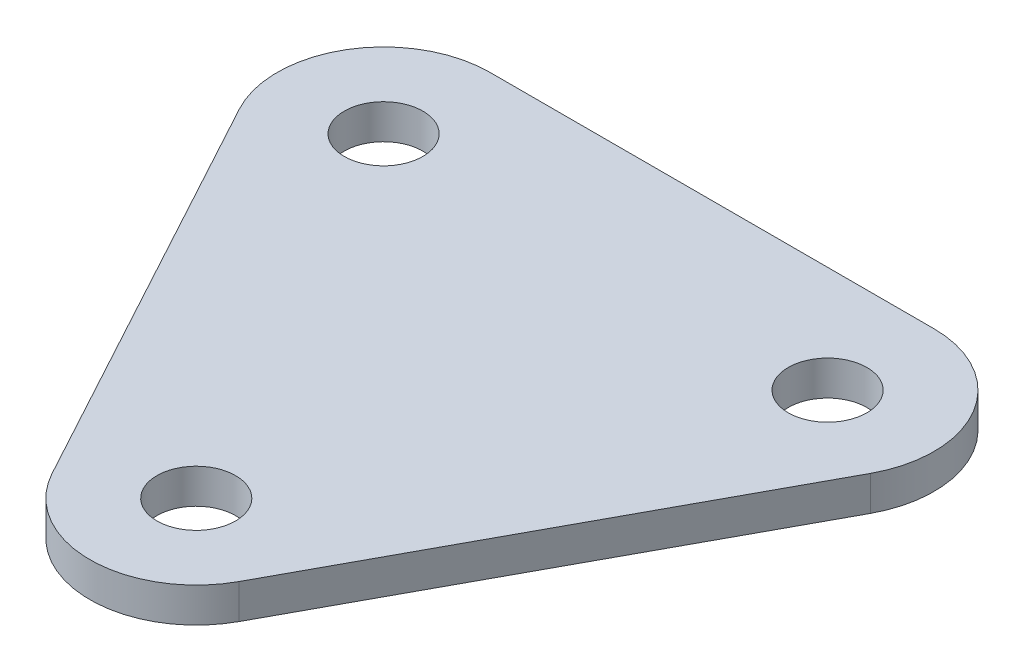
ISO-10303-21;
HEADER;
FILE_DESCRIPTION(('STEP AP214'),'2;1');
FILE_NAME('part.step','',(''),(''),'','','');
FILE_SCHEMA(('AUTOMOTIVE_DESIGN { 1 0 10303 214 1 1 1 1 }'));
ENDSEC;
DATA;
#1=APPLICATION_CONTEXT('core data for automotive mechanical design processes');
#2=APPLICATION_PROTOCOL_DEFINITION('international standard','automotive_design',2000,#1);
#3=PRODUCT_CONTEXT('',#1,'mechanical');
#4=PRODUCT('Part','Part','',(#3));
#5=PRODUCT_RELATED_PRODUCT_CATEGORY('part','',(#4));
#6=PRODUCT_DEFINITION_FORMATION('','',#4);
#7=PRODUCT_DEFINITION_CONTEXT('part definition',#1,'design');
#8=PRODUCT_DEFINITION('design','',#6,#7);
#9=PRODUCT_DEFINITION_SHAPE('','',#8);
#10=(LENGTH_UNIT() NAMED_UNIT(*) SI_UNIT(.MILLI.,.METRE.));
#11=(NAMED_UNIT(*) PLANE_ANGLE_UNIT() SI_UNIT($,.RADIAN.));
#12=(NAMED_UNIT(*) SI_UNIT($,.STERADIAN.) SOLID_ANGLE_UNIT());
#13=UNCERTAINTY_MEASURE_WITH_UNIT(LENGTH_MEASURE(1.E-05),#10,'distance_accuracy_value','');
#14=(GEOMETRIC_REPRESENTATION_CONTEXT(3) GLOBAL_UNCERTAINTY_ASSIGNED_CONTEXT((#13)) GLOBAL_UNIT_ASSIGNED_CONTEXT((#10,
#11,#12)) REPRESENTATION_CONTEXT('',''));
#15=CARTESIAN_POINT('',(0.,0.,0.));
#16=DIRECTION('',(0.,0.,1.));
#17=DIRECTION('',(1.,0.,0.));
#18=AXIS2_PLACEMENT_3D('',#15,#16,#17);
#19=CARTESIAN_POINT('',(48.,7.5,-38.059418617636));
#20=DIRECTION('',(0.,-1.,0.));
#21=DIRECTION('',(0.,0.,-1.));
#22=AXIS2_PLACEMENT_3D('',#19,#20,#21);
#23=CYLINDRICAL_SURFACE('',#22,23.);
#24=CARTESIAN_POINT('',(48.,0.,-38.059418617636));
#25=DIRECTION('',(0.,1.,0.));
#26=DIRECTION('',(0.,0.,1.));
#27=AXIS2_PLACEMENT_3D('',#24,#25,#26);
#28=CIRCLE('',#27,23.);
#29=CARTESIAN_POINT('',(48.,0.,-61.059418617636));
#30=VERTEX_POINT('',#29);
#31=CARTESIAN_POINT('',(68.2177326810248,0.,-27.0938686889446));
#32=VERTEX_POINT('',#31);
#33=EDGE_CURVE('E133',#30,#32,#28,.F.);
#34=ORIENTED_EDGE('',*,*,#33,.F.);
#35=DIRECTION('',(0.,-1.,0.));
#36=VECTOR('',#35,1.);
#37=CARTESIAN_POINT('',(48.,7.5,-61.059418617636));
#38=LINE('',#37,#36);
#39=CARTESIAN_POINT('',(48.,7.5,-61.059418617636));
#40=VERTEX_POINT('',#39);
#41=EDGE_CURVE('E11',#40,#30,#38,.T.);
#42=ORIENTED_EDGE('',*,*,#41,.F.);
#43=CARTESIAN_POINT('',(48.,7.5,-38.059418617636));
#44=DIRECTION('',(0.,1.,0.));
#45=DIRECTION('',(0.,0.,1.));
#46=AXIS2_PLACEMENT_3D('',#43,#44,#45);
#47=CIRCLE('',#46,23.);
#48=CARTESIAN_POINT('',(68.2177326810248,7.5,-27.0938686889446));
#49=VERTEX_POINT('',#48);
#50=EDGE_CURVE('E155',#40,#49,#47,.F.);
#51=ORIENTED_EDGE('',*,*,#50,.T.);
#52=DIRECTION('',(0.,-1.,0.));
#53=VECTOR('',#52,1.);
#54=CARTESIAN_POINT('',(68.2177326810248,7.5,-27.0938686889446));
#55=LINE('',#54,#53);
#56=EDGE_CURVE('E57',#49,#32,#55,.T.);
#57=ORIENTED_EDGE('',*,*,#56,.T.);
#58=EDGE_LOOP('',(#34,#42,#51,#57));
#59=FACE_BOUND('',#58,.T.);
#60=ADVANCED_FACE('F41',(#59),#23,.T.);
#61=CARTESIAN_POINT('',(0.,7.5,-61.0594186176359));
#62=DIRECTION('',(0.,0.,-1.));
#63=DIRECTION('',(-1.,0.,0.));
#64=AXIS2_PLACEMENT_3D('',#61,#62,#63);
#65=PLANE('',#64);
#66=DIRECTION('',(1.,0.,0.));
#67=VECTOR('',#66,1.);
#68=CARTESIAN_POINT('',(0.,0.,-61.0594186176359));
#69=LINE('',#68,#67);
#70=CARTESIAN_POINT('',(-48.0000000000001,0.,-61.0594186176359));
#71=VERTEX_POINT('',#70);
#72=EDGE_CURVE('E135',#71,#30,#69,.T.);
#73=ORIENTED_EDGE('',*,*,#72,.F.);
#74=DIRECTION('',(0.,-1.,0.));
#75=VECTOR('',#74,1.);
#76=CARTESIAN_POINT('',(-48.0000000000001,7.5,-61.0594186176359));
#77=LINE('',#76,#75);
#78=CARTESIAN_POINT('',(-48.0000000000001,7.5,-61.0594186176359));
#79=VERTEX_POINT('',#78);
#80=EDGE_CURVE('E49',#79,#71,#77,.T.);
#81=ORIENTED_EDGE('',*,*,#80,.F.);
#82=DIRECTION('',(1.,0.,0.));
#83=VECTOR('',#82,1.);
#84=CARTESIAN_POINT('',(0.,7.5,-61.0594186176359));
#85=LINE('',#84,#83);
#86=EDGE_CURVE('E168',#79,#40,#85,.T.);
#87=ORIENTED_EDGE('',*,*,#86,.T.);
#88=ORIENTED_EDGE('',*,*,#41,.T.);
#89=EDGE_LOOP('',(#73,#81,#87,#88));
#90=FACE_BOUND('',#89,.T.);
#91=ADVANCED_FACE('F167',(#90),#65,.T.);
#92=CARTESIAN_POINT('',(-48.,7.5,-38.0594186176359));
#93=DIRECTION('',(0.,-1.,0.));
#94=DIRECTION('',(0.,0.,-1.));
#95=AXIS2_PLACEMENT_3D('',#92,#93,#94);
#96=CYLINDRICAL_SURFACE('',#95,23.);
#97=CARTESIAN_POINT('',(-48.,0.,-38.0594186176359));
#98=DIRECTION('',(0.,1.,0.));
#99=DIRECTION('',(0.,0.,1.));
#100=AXIS2_PLACEMENT_3D('',#97,#98,#99);
#101=CIRCLE('',#100,23.);
#102=CARTESIAN_POINT('',(-68.2177326810247,0.,-27.0938686889446));
#103=VERTEX_POINT('',#102);
#104=EDGE_CURVE('E138',#71,#103,#101,.T.);
#105=ORIENTED_EDGE('',*,*,#104,.T.);
#106=DIRECTION('',(0.,-1.,0.));
#107=VECTOR('',#106,1.);
#108=CARTESIAN_POINT('',(-68.2177326810247,7.5,-27.0938686889446));
#109=LINE('',#108,#107);
#110=CARTESIAN_POINT('',(-68.2177326810247,7.5,-27.0938686889446));
#111=VERTEX_POINT('',#110);
#112=EDGE_CURVE('E116',#111,#103,#109,.T.);
#113=ORIENTED_EDGE('',*,*,#112,.F.);
#114=CARTESIAN_POINT('',(-48.,7.5,-38.0594186176359));
#115=DIRECTION('',(0.,1.,0.));
#116=DIRECTION('',(0.,0.,1.));
#117=AXIS2_PLACEMENT_3D('',#114,#115,#116);
#118=CIRCLE('',#117,23.);
#119=EDGE_CURVE('E104',#79,#111,#118,.T.);
#120=ORIENTED_EDGE('',*,*,#119,.F.);
#121=ORIENTED_EDGE('',*,*,#80,.T.);
#122=EDGE_LOOP('',(#105,#113,#120,#121));
#123=FACE_BOUND('',#122,.T.);
#124=ADVANCED_FACE('F160',(#123),#96,.T.);
#125=CARTESIAN_POINT('',(-41.3568708940998,7.5,22.4308452306982));
#126=DIRECTION('',(0.879031855696728,0.,-0.476763040377887));
#127=DIRECTION('',(-0.476763040377887,0.,-0.879031855696728));
#128=AXIS2_PLACEMENT_3D('',#125,#126,#127);
#129=PLANE('',#128);
#130=DIRECTION('',(0.476763040377887,0.,0.879031855696728));
#131=VECTOR('',#130,1.);
#132=CARTESIAN_POINT('',(-41.3568708940998,0.,22.4308452306982));
#133=LINE('',#132,#131);
#134=CARTESIAN_POINT('',(-20.2177326810247,0.,61.4061313110554));
#135=VERTEX_POINT('',#134);
#136=EDGE_CURVE('E113',#103,#135,#133,.T.);
#137=ORIENTED_EDGE('',*,*,#136,.T.);
#138=DIRECTION('',(0.,-1.,0.));
#139=VECTOR('',#138,1.);
#140=CARTESIAN_POINT('',(-20.2177326810247,7.5,61.4061313110554));
#141=LINE('',#140,#139);
#142=CARTESIAN_POINT('',(-20.2177326810247,7.5,61.4061313110554));
#143=VERTEX_POINT('',#142);
#144=EDGE_CURVE('E110',#143,#135,#141,.T.);
#145=ORIENTED_EDGE('',*,*,#144,.F.);
#146=DIRECTION('',(0.476763040377887,0.,0.879031855696728));
#147=VECTOR('',#146,1.);
#148=CARTESIAN_POINT('',(-41.3568708940998,7.5,22.4308452306982));
#149=LINE('',#148,#147);
#150=EDGE_CURVE('E95',#111,#143,#149,.T.);
#151=ORIENTED_EDGE('',*,*,#150,.F.);
#152=ORIENTED_EDGE('',*,*,#112,.T.);
#153=EDGE_LOOP('',(#137,#145,#151,#152));
#154=FACE_BOUND('',#153,.T.);
#155=ADVANCED_FACE('F111',(#154),#129,.F.);
#156=CARTESIAN_POINT('',(0.,7.5,50.440581382364));
#157=DIRECTION('',(0.,-1.,0.));
#158=DIRECTION('',(0.,0.,-1.));
#159=AXIS2_PLACEMENT_3D('',#156,#157,#158);
#160=CYLINDRICAL_SURFACE('',#159,23.);
#161=CARTESIAN_POINT('',(0.,0.,50.440581382364));
#162=DIRECTION('',(0.,1.,0.));
#163=DIRECTION('',(0.,0.,1.));
#164=AXIS2_PLACEMENT_3D('',#161,#162,#163);
#165=CIRCLE('',#164,23.);
#166=CARTESIAN_POINT('',(20.2177326810248,0.,61.4061313110554));
#167=VERTEX_POINT('',#166);
#168=EDGE_CURVE('E141',#167,#135,#165,.F.);
#169=ORIENTED_EDGE('',*,*,#168,.F.);
#170=DIRECTION('',(0.,-1.,0.));
#171=VECTOR('',#170,1.);
#172=CARTESIAN_POINT('',(20.2177326810248,7.5,61.4061313110554));
#173=LINE('',#172,#171);
#174=CARTESIAN_POINT('',(20.2177326810248,7.5,61.4061313110554));
#175=VERTEX_POINT('',#174);
#176=EDGE_CURVE('E76',#175,#167,#173,.T.);
#177=ORIENTED_EDGE('',*,*,#176,.F.);
#178=CARTESIAN_POINT('',(0.,7.5,50.440581382364));
#179=DIRECTION('',(0.,1.,0.));
#180=DIRECTION('',(0.,0.,1.));
#181=AXIS2_PLACEMENT_3D('',#178,#179,#180);
#182=CIRCLE('',#181,23.);
#183=EDGE_CURVE('E101',#175,#143,#182,.F.);
#184=ORIENTED_EDGE('',*,*,#183,.T.);
#185=ORIENTED_EDGE('',*,*,#144,.T.);
#186=EDGE_LOOP('',(#169,#177,#184,#185));
#187=FACE_BOUND('',#186,.T.);
#188=ADVANCED_FACE('F118',(#187),#160,.T.);
#189=CARTESIAN_POINT('',(-48.,7.5,-38.0594186176359));
#190=DIRECTION('',(0.,-1.,0.));
#191=DIRECTION('',(0.,0.,-1.));
#192=AXIS2_PLACEMENT_3D('',#189,#190,#191);
#193=CYLINDRICAL_SURFACE('',#192,8.5);
#194=CARTESIAN_POINT('',(-48.,7.5,-38.0594186176359));
#195=DIRECTION('',(0.,1.,0.));
#196=DIRECTION('',(0.,0.,1.));
#197=AXIS2_PLACEMENT_3D('',#194,#195,#196);
#198=CIRCLE('',#197,8.5);
#199=CARTESIAN_POINT('',(-48.,7.5,-29.5594186176359));
#200=VERTEX_POINT('',#199);
#201=EDGE_CURVE('E127',#200,#200,#198,.F.);
#202=ORIENTED_EDGE('',*,*,#201,.F.);
#203=EDGE_LOOP('',(#202));
#204=FACE_BOUND('',#203,.T.);
#205=CARTESIAN_POINT('',(-48.,0.,-38.0594186176359));
#206=DIRECTION('',(0.,1.,0.));
#207=DIRECTION('',(0.,0.,1.));
#208=AXIS2_PLACEMENT_3D('',#205,#206,#207);
#209=CIRCLE('',#208,8.5);
#210=CARTESIAN_POINT('',(-48.,0.,-29.5594186176359));
#211=VERTEX_POINT('',#210);
#212=EDGE_CURVE('E149',#211,#211,#209,.F.);
#213=ORIENTED_EDGE('',*,*,#212,.T.);
#214=EDGE_LOOP('',(#213));
#215=FACE_BOUND('',#214,.T.);
#216=ADVANCED_FACE('F180',(#204,#215),#193,.F.);
#217=CARTESIAN_POINT('',(0.,7.5,50.440581382364));
#218=DIRECTION('',(0.,-1.,0.));
#219=DIRECTION('',(0.,0.,-1.));
#220=AXIS2_PLACEMENT_3D('',#217,#218,#219);
#221=CYLINDRICAL_SURFACE('',#220,8.5);
#222=CARTESIAN_POINT('',(0.,7.5,50.440581382364));
#223=DIRECTION('',(0.,1.,0.));
#224=DIRECTION('',(0.,0.,1.));
#225=AXIS2_PLACEMENT_3D('',#222,#223,#224);
#226=CIRCLE('',#225,8.5);
#227=CARTESIAN_POINT('',(0.,7.5,58.940581382364));
#228=VERTEX_POINT('',#227);
#229=EDGE_CURVE('E121',#228,#228,#226,.T.);
#230=ORIENTED_EDGE('',*,*,#229,.T.);
#231=EDGE_LOOP('',(#230));
#232=FACE_BOUND('',#231,.T.);
#233=CARTESIAN_POINT('',(0.,0.,50.440581382364));
#234=DIRECTION('',(0.,1.,0.));
#235=DIRECTION('',(0.,0.,1.));
#236=AXIS2_PLACEMENT_3D('',#233,#234,#235);
#237=CIRCLE('',#236,8.5);
#238=CARTESIAN_POINT('',(0.,0.,58.940581382364));
#239=VERTEX_POINT('',#238);
#240=EDGE_CURVE('E146',#239,#239,#237,.T.);
#241=ORIENTED_EDGE('',*,*,#240,.F.);
#242=EDGE_LOOP('',(#241));
#243=FACE_BOUND('',#242,.T.);
#244=ADVANCED_FACE('F172',(#232,#243),#221,.F.);
#245=CARTESIAN_POINT('',(41.3568708940999,7.5,22.4308452306982));
#246=DIRECTION('',(0.879031855696728,0.,0.476763040377886));
#247=DIRECTION('',(0.476763040377886,0.,-0.879031855696728));
#248=AXIS2_PLACEMENT_3D('',#245,#246,#247);
#249=PLANE('',#248);
#250=DIRECTION('',(-0.476763040377886,0.,0.879031855696728));
#251=VECTOR('',#250,1.);
#252=CARTESIAN_POINT('',(41.3568708940999,0.,22.4308452306982));
#253=LINE('',#252,#251);
#254=EDGE_CURVE('E143',#32,#167,#253,.T.);
#255=ORIENTED_EDGE('',*,*,#254,.F.);
#256=ORIENTED_EDGE('',*,*,#56,.F.);
#257=DIRECTION('',(-0.476763040377886,0.,0.879031855696728));
#258=VECTOR('',#257,1.);
#259=CARTESIAN_POINT('',(41.3568708940999,7.5,22.4308452306982));
#260=LINE('',#259,#258);
#261=EDGE_CURVE('E119',#49,#175,#260,.T.);
#262=ORIENTED_EDGE('',*,*,#261,.T.);
#263=ORIENTED_EDGE('',*,*,#176,.T.);
#264=EDGE_LOOP('',(#255,#256,#262,#263));
#265=FACE_BOUND('',#264,.T.);
#266=ADVANCED_FACE('F169',(#265),#249,.T.);
#267=CARTESIAN_POINT('',(48.,7.5,-38.059418617636));
#268=DIRECTION('',(0.,-1.,0.));
#269=DIRECTION('',(0.,0.,-1.));
#270=AXIS2_PLACEMENT_3D('',#267,#268,#269);
#271=CYLINDRICAL_SURFACE('',#270,8.5);
#272=CARTESIAN_POINT('',(48.,7.5,-38.059418617636));
#273=DIRECTION('',(0.,1.,0.));
#274=DIRECTION('',(0.,0.,1.));
#275=AXIS2_PLACEMENT_3D('',#272,#273,#274);
#276=CIRCLE('',#275,8.5);
#277=CARTESIAN_POINT('',(48.,7.5,-29.559418617636));
#278=VERTEX_POINT('',#277);
#279=EDGE_CURVE('E130',#278,#278,#276,.T.);
#280=ORIENTED_EDGE('',*,*,#279,.T.);
#281=EDGE_LOOP('',(#280));
#282=FACE_BOUND('',#281,.T.);
#283=CARTESIAN_POINT('',(48.,0.,-38.059418617636));
#284=DIRECTION('',(0.,1.,0.));
#285=DIRECTION('',(0.,0.,1.));
#286=AXIS2_PLACEMENT_3D('',#283,#284,#285);
#287=CIRCLE('',#286,8.5);
#288=CARTESIAN_POINT('',(48.,0.,-29.559418617636));
#289=VERTEX_POINT('',#288);
#290=EDGE_CURVE('E152',#289,#289,#287,.T.);
#291=ORIENTED_EDGE('',*,*,#290,.F.);
#292=EDGE_LOOP('',(#291));
#293=FACE_BOUND('',#292,.T.);
#294=ADVANCED_FACE('F171',(#282,#293),#271,.F.);
#295=CARTESIAN_POINT('',(0.,7.5,0.));
#296=DIRECTION('',(0.,1.,0.));
#297=DIRECTION('',(0.,0.,1.));
#298=AXIS2_PLACEMENT_3D('',#295,#296,#297);
#299=PLANE('',#298);
#300=ORIENTED_EDGE('',*,*,#50,.F.);
#301=ORIENTED_EDGE('',*,*,#86,.F.);
#302=ORIENTED_EDGE('',*,*,#119,.T.);
#303=ORIENTED_EDGE('',*,*,#150,.T.);
#304=ORIENTED_EDGE('',*,*,#183,.F.);
#305=ORIENTED_EDGE('',*,*,#261,.F.);
#306=EDGE_LOOP('',(#300,#301,#302,#303,#304,#305));
#307=FACE_BOUND('',#306,.T.);
#308=ORIENTED_EDGE('',*,*,#229,.F.);
#309=EDGE_LOOP('',(#308));
#310=FACE_BOUND('',#309,.T.);
#311=ORIENTED_EDGE('',*,*,#201,.T.);
#312=EDGE_LOOP('',(#311));
#313=FACE_BOUND('',#312,.T.);
#314=ORIENTED_EDGE('',*,*,#279,.F.);
#315=EDGE_LOOP('',(#314));
#316=FACE_BOUND('',#315,.T.);
#317=ADVANCED_FACE('F97',(#307,#310,#313,#316),#299,.T.);
#318=CARTESIAN_POINT('',(0.,0.,0.));
#319=DIRECTION('',(0.,1.,0.));
#320=DIRECTION('',(0.,0.,1.));
#321=AXIS2_PLACEMENT_3D('',#318,#319,#320);
#322=PLANE('',#321);
#323=ORIENTED_EDGE('',*,*,#33,.T.);
#324=ORIENTED_EDGE('',*,*,#254,.T.);
#325=ORIENTED_EDGE('',*,*,#168,.T.);
#326=ORIENTED_EDGE('',*,*,#136,.F.);
#327=ORIENTED_EDGE('',*,*,#104,.F.);
#328=ORIENTED_EDGE('',*,*,#72,.T.);
#329=EDGE_LOOP('',(#323,#324,#325,#326,#327,#328));
#330=FACE_BOUND('',#329,.T.);
#331=ORIENTED_EDGE('',*,*,#240,.T.);
#332=EDGE_LOOP('',(#331));
#333=FACE_BOUND('',#332,.T.);
#334=ORIENTED_EDGE('',*,*,#212,.F.);
#335=EDGE_LOOP('',(#334));
#336=FACE_BOUND('',#335,.T.);
#337=ORIENTED_EDGE('',*,*,#290,.T.);
#338=EDGE_LOOP('',(#337));
#339=FACE_BOUND('',#338,.T.);
#340=ADVANCED_FACE('F165',(#330,#333,#336,#339),#322,.F.);
#341=CLOSED_SHELL('',(#60,#91,#124,#155,#188,#216,#244,#266,#294,#317,#340));
#342=MANIFOLD_SOLID_BREP('B2',#341);
#343=ADVANCED_BREP_SHAPE_REPRESENTATION('',(#18,#342),#14);
#344=SHAPE_DEFINITION_REPRESENTATION(#9,#343);
ENDSEC;
END-ISO-10303-21;
